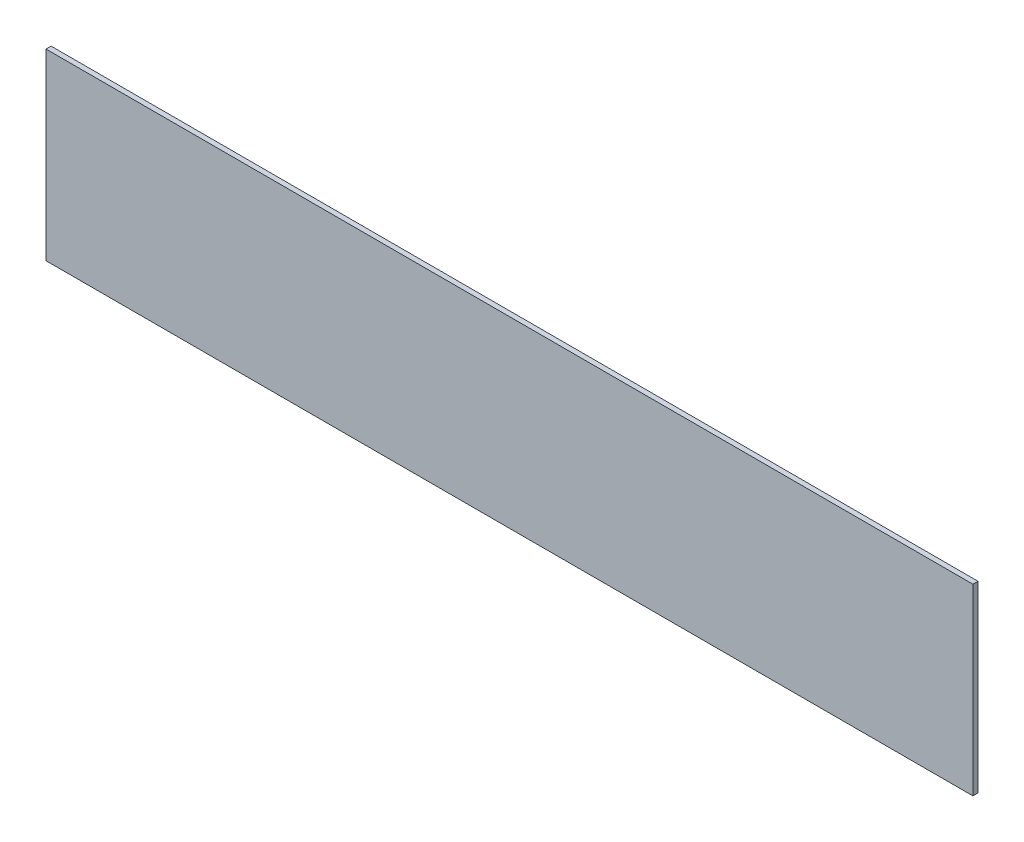
ISO-10303-21;
HEADER;
FILE_DESCRIPTION(('STEP AP214'),'2;1');
FILE_NAME('part.step','',(''),(''),'','','');
FILE_SCHEMA(('AUTOMOTIVE_DESIGN { 1 0 10303 214 1 1 1 1 }'));
ENDSEC;
DATA;
#1=APPLICATION_CONTEXT('core data for automotive mechanical design processes');
#2=APPLICATION_PROTOCOL_DEFINITION('international standard','automotive_design',2000,#1);
#3=PRODUCT_CONTEXT('',#1,'mechanical');
#4=PRODUCT('Part','Part','',(#3));
#5=PRODUCT_RELATED_PRODUCT_CATEGORY('part','',(#4));
#6=PRODUCT_DEFINITION_FORMATION('','',#4);
#7=PRODUCT_DEFINITION_CONTEXT('part definition',#1,'design');
#8=PRODUCT_DEFINITION('design','',#6,#7);
#9=PRODUCT_DEFINITION_SHAPE('','',#8);
#10=(LENGTH_UNIT() NAMED_UNIT(*) SI_UNIT(.MILLI.,.METRE.));
#11=(NAMED_UNIT(*) PLANE_ANGLE_UNIT() SI_UNIT($,.RADIAN.));
#12=(NAMED_UNIT(*) SI_UNIT($,.STERADIAN.) SOLID_ANGLE_UNIT());
#13=UNCERTAINTY_MEASURE_WITH_UNIT(LENGTH_MEASURE(1.E-05),#10,'distance_accuracy_value','');
#14=(GEOMETRIC_REPRESENTATION_CONTEXT(3) GLOBAL_UNCERTAINTY_ASSIGNED_CONTEXT((#13)) GLOBAL_UNIT_ASSIGNED_CONTEXT((#10,
#11,#12)) REPRESENTATION_CONTEXT('',''));
#15=CARTESIAN_POINT('',(0.,0.,0.));
#16=DIRECTION('',(0.,0.,1.));
#17=DIRECTION('',(1.,0.,0.));
#18=AXIS2_PLACEMENT_3D('',#15,#16,#17);
#19=CARTESIAN_POINT('',(259.,312.,27.));
#20=DIRECTION('',(1.,0.,0.));
#21=DIRECTION('',(0.,0.,-1.));
#22=AXIS2_PLACEMENT_3D('',#19,#20,#21);
#23=PLANE('',#22);
#24=DIRECTION('',(0.,-1.,0.));
#25=VECTOR('',#24,1.);
#26=CARTESIAN_POINT('',(259.,312.,26.));
#27=LINE('',#26,#25);
#28=CARTESIAN_POINT('',(259.,348.,26.));
#29=VERTEX_POINT('',#28);
#30=CARTESIAN_POINT('',(259.,312.,26.));
#31=VERTEX_POINT('',#30);
#32=EDGE_CURVE('E102',#29,#31,#27,.T.);
#33=ORIENTED_EDGE('',*,*,#32,.T.);
#34=DIRECTION('',(0.,0.,-1.));
#35=VECTOR('',#34,1.);
#36=CARTESIAN_POINT('',(259.,312.,27.));
#37=LINE('',#36,#35);
#38=CARTESIAN_POINT('',(259.,312.,27.));
#39=VERTEX_POINT('',#38);
#40=EDGE_CURVE('E11',#39,#31,#37,.T.);
#41=ORIENTED_EDGE('',*,*,#40,.F.);
#42=DIRECTION('',(0.,-1.,0.));
#43=VECTOR('',#42,1.);
#44=CARTESIAN_POINT('',(259.,312.,27.));
#45=LINE('',#44,#43);
#46=CARTESIAN_POINT('',(259.,348.,27.));
#47=VERTEX_POINT('',#46);
#48=EDGE_CURVE('E90',#47,#39,#45,.T.);
#49=ORIENTED_EDGE('',*,*,#48,.F.);
#50=DIRECTION('',(0.,0.,-1.));
#51=VECTOR('',#50,1.);
#52=CARTESIAN_POINT('',(259.,348.,27.));
#53=LINE('',#52,#51);
#54=EDGE_CURVE('E98',#47,#29,#53,.T.);
#55=ORIENTED_EDGE('',*,*,#54,.T.);
#56=EDGE_LOOP('',(#33,#41,#49,#55));
#57=FACE_BOUND('',#56,.T.);
#58=ADVANCED_FACE('F39',(#57),#23,.F.);
#59=CARTESIAN_POINT('',(259.,312.,27.));
#60=DIRECTION('',(0.,1.,0.));
#61=DIRECTION('',(0.,0.,1.));
#62=AXIS2_PLACEMENT_3D('',#59,#60,#61);
#63=PLANE('',#62);
#64=DIRECTION('',(1.,0.,0.));
#65=VECTOR('',#64,1.);
#66=CARTESIAN_POINT('',(259.,312.,26.));
#67=LINE('',#66,#65);
#68=CARTESIAN_POINT('',(441.,312.,26.));
#69=VERTEX_POINT('',#68);
#70=EDGE_CURVE('E94',#31,#69,#67,.T.);
#71=ORIENTED_EDGE('',*,*,#70,.T.);
#72=DIRECTION('',(0.,0.,-1.));
#73=VECTOR('',#72,1.);
#74=CARTESIAN_POINT('',(441.,312.,27.));
#75=LINE('',#74,#73);
#76=CARTESIAN_POINT('',(441.,312.,27.));
#77=VERTEX_POINT('',#76);
#78=EDGE_CURVE('E47',#77,#69,#75,.T.);
#79=ORIENTED_EDGE('',*,*,#78,.F.);
#80=DIRECTION('',(1.,0.,0.));
#81=VECTOR('',#80,1.);
#82=CARTESIAN_POINT('',(259.,312.,27.));
#83=LINE('',#82,#81);
#84=EDGE_CURVE('E85',#39,#77,#83,.T.);
#85=ORIENTED_EDGE('',*,*,#84,.F.);
#86=ORIENTED_EDGE('',*,*,#40,.T.);
#87=EDGE_LOOP('',(#71,#79,#85,#86));
#88=FACE_BOUND('',#87,.T.);
#89=ADVANCED_FACE('F93',(#88),#63,.F.);
#90=CARTESIAN_POINT('',(441.,312.,27.));
#91=DIRECTION('',(-1.,0.,0.));
#92=DIRECTION('',(0.,0.,1.));
#93=AXIS2_PLACEMENT_3D('',#90,#91,#92);
#94=PLANE('',#93);
#95=DIRECTION('',(0.,1.,0.));
#96=VECTOR('',#95,1.);
#97=CARTESIAN_POINT('',(441.,312.,26.));
#98=LINE('',#97,#96);
#99=CARTESIAN_POINT('',(441.,348.,26.));
#100=VERTEX_POINT('',#99);
#101=EDGE_CURVE('E72',#69,#100,#98,.T.);
#102=ORIENTED_EDGE('',*,*,#101,.T.);
#103=DIRECTION('',(0.,0.,-1.));
#104=VECTOR('',#103,1.);
#105=CARTESIAN_POINT('',(441.,348.,27.));
#106=LINE('',#105,#104);
#107=CARTESIAN_POINT('',(441.,348.,27.));
#108=VERTEX_POINT('',#107);
#109=EDGE_CURVE('E95',#108,#100,#106,.T.);
#110=ORIENTED_EDGE('',*,*,#109,.F.);
#111=DIRECTION('',(0.,1.,0.));
#112=VECTOR('',#111,1.);
#113=CARTESIAN_POINT('',(441.,312.,27.));
#114=LINE('',#113,#112);
#115=EDGE_CURVE('E88',#77,#108,#114,.T.);
#116=ORIENTED_EDGE('',*,*,#115,.F.);
#117=ORIENTED_EDGE('',*,*,#78,.T.);
#118=EDGE_LOOP('',(#102,#110,#116,#117));
#119=FACE_BOUND('',#118,.T.);
#120=ADVANCED_FACE('F96',(#119),#94,.F.);
#121=CARTESIAN_POINT('',(259.,348.,27.));
#122=DIRECTION('',(0.,-1.,0.));
#123=DIRECTION('',(0.,0.,-1.));
#124=AXIS2_PLACEMENT_3D('',#121,#122,#123);
#125=PLANE('',#124);
#126=DIRECTION('',(-1.,0.,0.));
#127=VECTOR('',#126,1.);
#128=CARTESIAN_POINT('',(259.,348.,26.));
#129=LINE('',#128,#127);
#130=EDGE_CURVE('E78',#100,#29,#129,.T.);
#131=ORIENTED_EDGE('',*,*,#130,.T.);
#132=ORIENTED_EDGE('',*,*,#54,.F.);
#133=DIRECTION('',(-1.,0.,0.));
#134=VECTOR('',#133,1.);
#135=CARTESIAN_POINT('',(259.,348.,27.));
#136=LINE('',#135,#134);
#137=EDGE_CURVE('E55',#108,#47,#136,.T.);
#138=ORIENTED_EDGE('',*,*,#137,.F.);
#139=ORIENTED_EDGE('',*,*,#109,.T.);
#140=EDGE_LOOP('',(#131,#132,#138,#139));
#141=FACE_BOUND('',#140,.T.);
#142=ADVANCED_FACE('F109',(#141),#125,.F.);
#143=CARTESIAN_POINT('',(0.,0.,27.));
#144=DIRECTION('',(0.,0.,-1.));
#145=DIRECTION('',(-1.,0.,0.));
#146=AXIS2_PLACEMENT_3D('',#143,#144,#145);
#147=PLANE('',#146);
#148=ORIENTED_EDGE('',*,*,#48,.T.);
#149=ORIENTED_EDGE('',*,*,#84,.T.);
#150=ORIENTED_EDGE('',*,*,#115,.T.);
#151=ORIENTED_EDGE('',*,*,#137,.T.);
#152=EDGE_LOOP('',(#148,#149,#150,#151));
#153=FACE_BOUND('',#152,.T.);
#154=ADVANCED_FACE('F86',(#153),#147,.F.);
#155=CARTESIAN_POINT('',(0.,0.,26.));
#156=DIRECTION('',(0.,0.,-1.));
#157=DIRECTION('',(-1.,0.,0.));
#158=AXIS2_PLACEMENT_3D('',#155,#156,#157);
#159=PLANE('',#158);
#160=ORIENTED_EDGE('',*,*,#32,.F.);
#161=ORIENTED_EDGE('',*,*,#130,.F.);
#162=ORIENTED_EDGE('',*,*,#101,.F.);
#163=ORIENTED_EDGE('',*,*,#70,.F.);
#164=EDGE_LOOP('',(#160,#161,#162,#163));
#165=FACE_BOUND('',#164,.T.);
#166=ADVANCED_FACE('F112',(#165),#159,.T.);
#167=CLOSED_SHELL('',(#58,#89,#120,#142,#154,#166));
#168=MANIFOLD_SOLID_BREP('B2',#167);
#169=ADVANCED_BREP_SHAPE_REPRESENTATION('',(#18,#168),#14);
#170=SHAPE_DEFINITION_REPRESENTATION(#9,#169);
ENDSEC;
END-ISO-10303-21;
